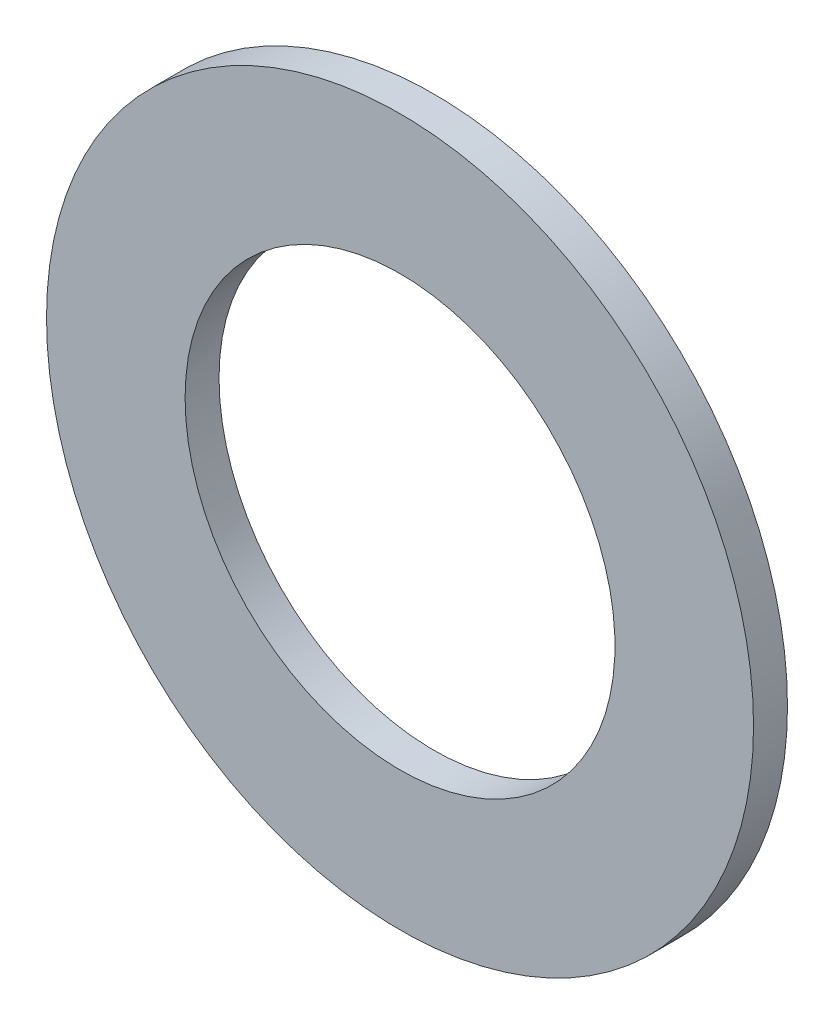
ISO-10303-21;
HEADER;
FILE_DESCRIPTION(('STEP AP214'),'2;1');
FILE_NAME('part.step','',(''),(''),'','','');
FILE_SCHEMA(('AUTOMOTIVE_DESIGN { 1 0 10303 214 1 1 1 1 }'));
ENDSEC;
DATA;
#1=APPLICATION_CONTEXT('core data for automotive mechanical design processes');
#2=APPLICATION_PROTOCOL_DEFINITION('international standard','automotive_design',2000,#1);
#3=PRODUCT_CONTEXT('',#1,'mechanical');
#4=PRODUCT('Part','Part','',(#3));
#5=PRODUCT_RELATED_PRODUCT_CATEGORY('part','',(#4));
#6=PRODUCT_DEFINITION_FORMATION('','',#4);
#7=PRODUCT_DEFINITION_CONTEXT('part definition',#1,'design');
#8=PRODUCT_DEFINITION('design','',#6,#7);
#9=PRODUCT_DEFINITION_SHAPE('','',#8);
#10=(LENGTH_UNIT() NAMED_UNIT(*) SI_UNIT(.MILLI.,.METRE.));
#11=(NAMED_UNIT(*) PLANE_ANGLE_UNIT() SI_UNIT($,.RADIAN.));
#12=(NAMED_UNIT(*) SI_UNIT($,.STERADIAN.) SOLID_ANGLE_UNIT());
#13=UNCERTAINTY_MEASURE_WITH_UNIT(LENGTH_MEASURE(1.E-05),#10,'distance_accuracy_value','');
#14=(GEOMETRIC_REPRESENTATION_CONTEXT(3) GLOBAL_UNCERTAINTY_ASSIGNED_CONTEXT((#13)) GLOBAL_UNIT_ASSIGNED_CONTEXT((#10,
#11,#12)) REPRESENTATION_CONTEXT('',''));
#15=CARTESIAN_POINT('',(0.,0.,0.));
#16=DIRECTION('',(0.,0.,1.));
#17=DIRECTION('',(1.,0.,0.));
#18=AXIS2_PLACEMENT_3D('',#15,#16,#17);
#19=CARTESIAN_POINT('',(0.,0.,1.524));
#20=DIRECTION('',(0.,0.,1.));
#21=DIRECTION('',(1.,0.,0.));
#22=AXIS2_PLACEMENT_3D('',#19,#20,#21);
#23=PLANE('',#22);
#24=CARTESIAN_POINT('',(0.,0.,1.524));
#25=DIRECTION('',(0.,0.,1.));
#26=DIRECTION('',(1.,0.,0.));
#27=AXIS2_PLACEMENT_3D('',#24,#25,#26);
#28=CIRCLE('',#27,15.875);
#29=CARTESIAN_POINT('',(-15.875,0.,1.524));
#30=VERTEX_POINT('',#29);
#31=EDGE_CURVE('E10',#30,#30,#28,.T.);
#32=ORIENTED_EDGE('',*,*,#31,.T.);
#33=EDGE_LOOP('',(#32));
#34=FACE_BOUND('',#33,.T.);
#35=CARTESIAN_POINT('',(0.,0.,1.524));
#36=DIRECTION('',(0.,0.,1.));
#37=DIRECTION('',(1.,0.,0.));
#38=AXIS2_PLACEMENT_3D('',#35,#36,#37);
#39=CIRCLE('',#38,9.652);
#40=CARTESIAN_POINT('',(-9.652,0.,1.524));
#41=VERTEX_POINT('',#40);
#42=EDGE_CURVE('E43',#41,#41,#39,.T.);
#43=ORIENTED_EDGE('',*,*,#42,.F.);
#44=EDGE_LOOP('',(#43));
#45=FACE_BOUND('',#44,.T.);
#46=ADVANCED_FACE('F32',(#34,#45),#23,.T.);
#47=CARTESIAN_POINT('',(0.,0.,0.));
#48=DIRECTION('',(0.,0.,1.));
#49=DIRECTION('',(1.,0.,0.));
#50=AXIS2_PLACEMENT_3D('',#47,#48,#49);
#51=PLANE('',#50);
#52=CARTESIAN_POINT('',(0.,0.,0.));
#53=DIRECTION('',(0.,0.,1.));
#54=DIRECTION('',(1.,0.,0.));
#55=AXIS2_PLACEMENT_3D('',#52,#53,#54);
#56=CIRCLE('',#55,15.875);
#57=CARTESIAN_POINT('',(-15.875,0.,0.));
#58=VERTEX_POINT('',#57);
#59=EDGE_CURVE('E36',#58,#58,#56,.T.);
#60=ORIENTED_EDGE('',*,*,#59,.F.);
#61=EDGE_LOOP('',(#60));
#62=FACE_BOUND('',#61,.T.);
#63=CARTESIAN_POINT('',(0.,0.,0.));
#64=DIRECTION('',(0.,0.,1.));
#65=DIRECTION('',(1.,0.,0.));
#66=AXIS2_PLACEMENT_3D('',#63,#64,#65);
#67=CIRCLE('',#66,9.652);
#68=CARTESIAN_POINT('',(-9.652,0.,0.));
#69=VERTEX_POINT('',#68);
#70=EDGE_CURVE('E45',#69,#69,#67,.T.);
#71=ORIENTED_EDGE('',*,*,#70,.T.);
#72=EDGE_LOOP('',(#71));
#73=FACE_BOUND('',#72,.T.);
#74=ADVANCED_FACE('F55',(#62,#73),#51,.F.);
#75=CARTESIAN_POINT('',(0.,0.,1.524));
#76=DIRECTION('',(0.,0.,-1.));
#77=DIRECTION('',(-1.,0.,0.));
#78=AXIS2_PLACEMENT_3D('',#75,#76,#77);
#79=CYLINDRICAL_SURFACE('',#78,15.875);
#80=CARTESIAN_POINT('',(-15.875,0.,1.524));
#81=CARTESIAN_POINT('',(-15.875,0.,1.508125));
#82=CARTESIAN_POINT('',(-15.875,0.,1.49225));
#83=CARTESIAN_POINT('',(-15.875,0.,1.4605));
#84=CARTESIAN_POINT('',(-15.875,0.,1.444625));
#85=CARTESIAN_POINT('',(-15.875,0.,1.412875));
#86=CARTESIAN_POINT('',(-15.875,0.,1.397));
#87=CARTESIAN_POINT('',(-15.875,0.,1.36525));
#88=CARTESIAN_POINT('',(-15.875,0.,1.349375));
#89=CARTESIAN_POINT('',(-15.875,0.,1.317625));
#90=CARTESIAN_POINT('',(-15.875,0.,1.30175));
#91=CARTESIAN_POINT('',(-15.875,0.,1.27));
#92=CARTESIAN_POINT('',(-15.875,0.,1.254125));
#93=CARTESIAN_POINT('',(-15.875,0.,1.222375));
#94=CARTESIAN_POINT('',(-15.875,0.,1.2065));
#95=CARTESIAN_POINT('',(-15.875,0.,1.17475));
#96=CARTESIAN_POINT('',(-15.875,0.,1.158875));
#97=CARTESIAN_POINT('',(-15.875,0.,1.127125));
#98=CARTESIAN_POINT('',(-15.875,0.,1.11125));
#99=CARTESIAN_POINT('',(-15.875,0.,1.0795));
#100=CARTESIAN_POINT('',(-15.875,0.,1.063625));
#101=CARTESIAN_POINT('',(-15.875,0.,1.031875));
#102=CARTESIAN_POINT('',(-15.875,0.,1.016));
#103=CARTESIAN_POINT('',(-15.875,0.,0.98425));
#104=CARTESIAN_POINT('',(-15.875,0.,0.968375));
#105=CARTESIAN_POINT('',(-15.875,0.,0.936625));
#106=CARTESIAN_POINT('',(-15.875,0.,0.92075));
#107=CARTESIAN_POINT('',(-15.875,0.,0.889));
#108=CARTESIAN_POINT('',(-15.875,0.,0.873125));
#109=CARTESIAN_POINT('',(-15.875,0.,0.841375));
#110=CARTESIAN_POINT('',(-15.875,0.,0.8255));
#111=CARTESIAN_POINT('',(-15.875,0.,0.79375));
#112=CARTESIAN_POINT('',(-15.875,0.,0.777875));
#113=CARTESIAN_POINT('',(-15.875,0.,0.746125));
#114=CARTESIAN_POINT('',(-15.875,0.,0.73025));
#115=CARTESIAN_POINT('',(-15.875,0.,0.6985));
#116=CARTESIAN_POINT('',(-15.875,0.,0.682625));
#117=CARTESIAN_POINT('',(-15.875,0.,0.650875));
#118=CARTESIAN_POINT('',(-15.875,0.,0.635));
#119=CARTESIAN_POINT('',(-15.875,0.,0.60325));
#120=CARTESIAN_POINT('',(-15.875,0.,0.587375));
#121=CARTESIAN_POINT('',(-15.875,0.,0.555625));
#122=CARTESIAN_POINT('',(-15.875,0.,0.53975));
#123=CARTESIAN_POINT('',(-15.875,0.,0.508));
#124=CARTESIAN_POINT('',(-15.875,0.,0.492125));
#125=CARTESIAN_POINT('',(-15.875,0.,0.460375));
#126=CARTESIAN_POINT('',(-15.875,0.,0.4445));
#127=CARTESIAN_POINT('',(-15.875,0.,0.41275));
#128=CARTESIAN_POINT('',(-15.875,0.,0.396875));
#129=CARTESIAN_POINT('',(-15.875,0.,0.365125));
#130=CARTESIAN_POINT('',(-15.875,0.,0.34925));
#131=CARTESIAN_POINT('',(-15.875,0.,0.3175));
#132=CARTESIAN_POINT('',(-15.875,0.,0.301625));
#133=CARTESIAN_POINT('',(-15.875,0.,0.269875));
#134=CARTESIAN_POINT('',(-15.875,0.,0.254));
#135=CARTESIAN_POINT('',(-15.875,0.,0.22225));
#136=CARTESIAN_POINT('',(-15.875,0.,0.206375));
#137=CARTESIAN_POINT('',(-15.875,0.,0.174625));
#138=CARTESIAN_POINT('',(-15.875,0.,0.15875));
#139=CARTESIAN_POINT('',(-15.875,0.,0.127));
#140=CARTESIAN_POINT('',(-15.875,0.,0.111125));
#141=CARTESIAN_POINT('',(-15.875,0.,0.079375));
#142=CARTESIAN_POINT('',(-15.875,0.,0.0635));
#143=CARTESIAN_POINT('',(-15.875,0.,0.0317499999999999));
#144=CARTESIAN_POINT('',(-15.875,0.,0.015875));
#145=CARTESIAN_POINT('',(-15.875,0.,0.));
#146=B_SPLINE_CURVE_WITH_KNOTS('',3,(#80,#81,#82,#83,#84,#85,#86,#87,#88,#89,#90,#91,#92,#93,
#94,#95,#96,#97,#98,#99,#100,#101,#102,#103,#104,#105,#106,#107,#108,#109,#110,#111,#112,#113,
#114,#115,#116,#117,#118,#119,#120,#121,#122,#123,#124,#125,#126,#127,#128,#129,#130,#131,#132,
#133,#134,#135,#136,#137,#138,#139,#140,#141,#142,#143,#144,#145),.UNSPECIFIED.,.F.,.F.,(4,2,2,
2,2,2,2,2,2,2,2,2,2,2,2,2,2,2,2,2,2,2,2,2,2,2,2,2,2,2,2,2,4),(0.,0.0476249999999999,
0.0952499999999998,0.142875,0.1905,0.238125,0.28575,0.333375,0.381,0.428625,0.47625,0.523875,
0.5715,0.619125,0.66675,0.714375,0.762,0.809625,0.85725,0.904875,0.9525,1.000125,1.04775,
1.095375,1.143,1.190625,1.23825,1.285875,1.3335,1.381125,1.42875,1.476375,1.524),.UNSPECIFIED.);
#147=EDGE_CURVE('BSEAM34',#30,#58,#146,.T.);
#148=ORIENTED_EDGE('',*,*,#31,.F.);
#149=ORIENTED_EDGE('',*,*,#59,.T.);
#150=ORIENTED_EDGE('',*,*,#147,.T.);
#151=ORIENTED_EDGE('',*,*,#147,.F.);
#152=EDGE_LOOP('',(#148,#150,#149,#151));
#153=FACE_BOUND('',#152,.T.);
#154=ADVANCED_FACE('F34',(#153),#79,.T.);
#155=CARTESIAN_POINT('',(0.,0.,1.524));
#156=DIRECTION('',(0.,0.,-1.));
#157=DIRECTION('',(-1.,0.,0.));
#158=AXIS2_PLACEMENT_3D('',#155,#156,#157);
#159=CYLINDRICAL_SURFACE('',#158,9.652);
#160=CARTESIAN_POINT('',(-9.652,0.,1.524));
#161=CARTESIAN_POINT('',(-9.652,0.,1.508125));
#162=CARTESIAN_POINT('',(-9.652,0.,1.49225));
#163=CARTESIAN_POINT('',(-9.652,0.,1.4605));
#164=CARTESIAN_POINT('',(-9.652,0.,1.444625));
#165=CARTESIAN_POINT('',(-9.652,0.,1.412875));
#166=CARTESIAN_POINT('',(-9.652,0.,1.397));
#167=CARTESIAN_POINT('',(-9.652,0.,1.36525));
#168=CARTESIAN_POINT('',(-9.652,0.,1.349375));
#169=CARTESIAN_POINT('',(-9.652,0.,1.317625));
#170=CARTESIAN_POINT('',(-9.652,0.,1.30175));
#171=CARTESIAN_POINT('',(-9.652,0.,1.27));
#172=CARTESIAN_POINT('',(-9.652,0.,1.254125));
#173=CARTESIAN_POINT('',(-9.652,0.,1.222375));
#174=CARTESIAN_POINT('',(-9.652,0.,1.2065));
#175=CARTESIAN_POINT('',(-9.652,0.,1.17475));
#176=CARTESIAN_POINT('',(-9.652,0.,1.158875));
#177=CARTESIAN_POINT('',(-9.652,0.,1.127125));
#178=CARTESIAN_POINT('',(-9.652,0.,1.11125));
#179=CARTESIAN_POINT('',(-9.652,0.,1.0795));
#180=CARTESIAN_POINT('',(-9.652,0.,1.063625));
#181=CARTESIAN_POINT('',(-9.652,0.,1.031875));
#182=CARTESIAN_POINT('',(-9.652,0.,1.016));
#183=CARTESIAN_POINT('',(-9.652,0.,0.98425));
#184=CARTESIAN_POINT('',(-9.652,0.,0.968375));
#185=CARTESIAN_POINT('',(-9.652,0.,0.936625));
#186=CARTESIAN_POINT('',(-9.652,0.,0.92075));
#187=CARTESIAN_POINT('',(-9.652,0.,0.889));
#188=CARTESIAN_POINT('',(-9.652,0.,0.873125));
#189=CARTESIAN_POINT('',(-9.652,0.,0.841375));
#190=CARTESIAN_POINT('',(-9.652,0.,0.8255));
#191=CARTESIAN_POINT('',(-9.652,0.,0.79375));
#192=CARTESIAN_POINT('',(-9.652,0.,0.777875));
#193=CARTESIAN_POINT('',(-9.652,0.,0.746125));
#194=CARTESIAN_POINT('',(-9.652,0.,0.73025));
#195=CARTESIAN_POINT('',(-9.652,0.,0.6985));
#196=CARTESIAN_POINT('',(-9.652,0.,0.682625));
#197=CARTESIAN_POINT('',(-9.652,0.,0.650875));
#198=CARTESIAN_POINT('',(-9.652,0.,0.635));
#199=CARTESIAN_POINT('',(-9.652,0.,0.60325));
#200=CARTESIAN_POINT('',(-9.652,0.,0.587375));
#201=CARTESIAN_POINT('',(-9.652,0.,0.555625));
#202=CARTESIAN_POINT('',(-9.652,0.,0.53975));
#203=CARTESIAN_POINT('',(-9.652,0.,0.508));
#204=CARTESIAN_POINT('',(-9.652,0.,0.492125));
#205=CARTESIAN_POINT('',(-9.652,0.,0.460375));
#206=CARTESIAN_POINT('',(-9.652,0.,0.4445));
#207=CARTESIAN_POINT('',(-9.652,0.,0.41275));
#208=CARTESIAN_POINT('',(-9.652,0.,0.396875));
#209=CARTESIAN_POINT('',(-9.652,0.,0.365125));
#210=CARTESIAN_POINT('',(-9.652,0.,0.34925));
#211=CARTESIAN_POINT('',(-9.652,0.,0.3175));
#212=CARTESIAN_POINT('',(-9.652,0.,0.301625));
#213=CARTESIAN_POINT('',(-9.652,0.,0.269875));
#214=CARTESIAN_POINT('',(-9.652,0.,0.254));
#215=CARTESIAN_POINT('',(-9.652,0.,0.22225));
#216=CARTESIAN_POINT('',(-9.652,0.,0.206375));
#217=CARTESIAN_POINT('',(-9.652,0.,0.174625));
#218=CARTESIAN_POINT('',(-9.652,0.,0.15875));
#219=CARTESIAN_POINT('',(-9.652,0.,0.127));
#220=CARTESIAN_POINT('',(-9.652,0.,0.111125));
#221=CARTESIAN_POINT('',(-9.652,0.,0.079375));
#222=CARTESIAN_POINT('',(-9.652,0.,0.0635));
#223=CARTESIAN_POINT('',(-9.652,0.,0.0317499999999999));
#224=CARTESIAN_POINT('',(-9.652,0.,0.015875));
#225=CARTESIAN_POINT('',(-9.652,0.,0.));
#226=B_SPLINE_CURVE_WITH_KNOTS('',3,(#160,#161,#162,#163,#164,#165,#166,#167,#168,#169,#170,
#171,#172,#173,#174,#175,#176,#177,#178,#179,#180,#181,#182,#183,#184,#185,#186,#187,#188,#189,
#190,#191,#192,#193,#194,#195,#196,#197,#198,#199,#200,#201,#202,#203,#204,#205,#206,#207,#208,
#209,#210,#211,#212,#213,#214,#215,#216,#217,#218,#219,#220,#221,#222,#223,#224,#225),
.UNSPECIFIED.,.F.,.F.,(4,2,2,2,2,2,2,2,2,2,2,2,2,2,2,2,2,2,2,2,2,2,2,2,2,2,2,2,2,2,2,2,4),(0.,
0.0476250000000001,0.0952500000000001,0.142875,0.1905,0.238125,0.28575,0.333375,0.381,0.428625,
0.47625,0.523875,0.5715,0.619125,0.66675,0.714375,0.762,0.809625,0.85725,0.904875,0.9525,
1.000125,1.04775,1.095375,1.143,1.190625,1.23825,1.285875,1.3335,1.381125,1.42875,1.476375,
1.524),.UNSPECIFIED.);
#227=EDGE_CURVE('BSEAM51',#41,#69,#226,.T.);
#228=ORIENTED_EDGE('',*,*,#42,.T.);
#229=ORIENTED_EDGE('',*,*,#70,.F.);
#230=ORIENTED_EDGE('',*,*,#227,.T.);
#231=ORIENTED_EDGE('',*,*,#227,.F.);
#232=EDGE_LOOP('',(#228,#230,#229,#231));
#233=FACE_BOUND('',#232,.T.);
#234=ADVANCED_FACE('F51',(#233),#159,.F.);
#235=CLOSED_SHELL('',(#46,#74,#154,#234));
#236=MANIFOLD_SOLID_BREP('B2',#235);
#237=ADVANCED_BREP_SHAPE_REPRESENTATION('',(#18,#236),#14);
#238=SHAPE_DEFINITION_REPRESENTATION(#9,#237);
ENDSEC;
END-ISO-10303-21;
